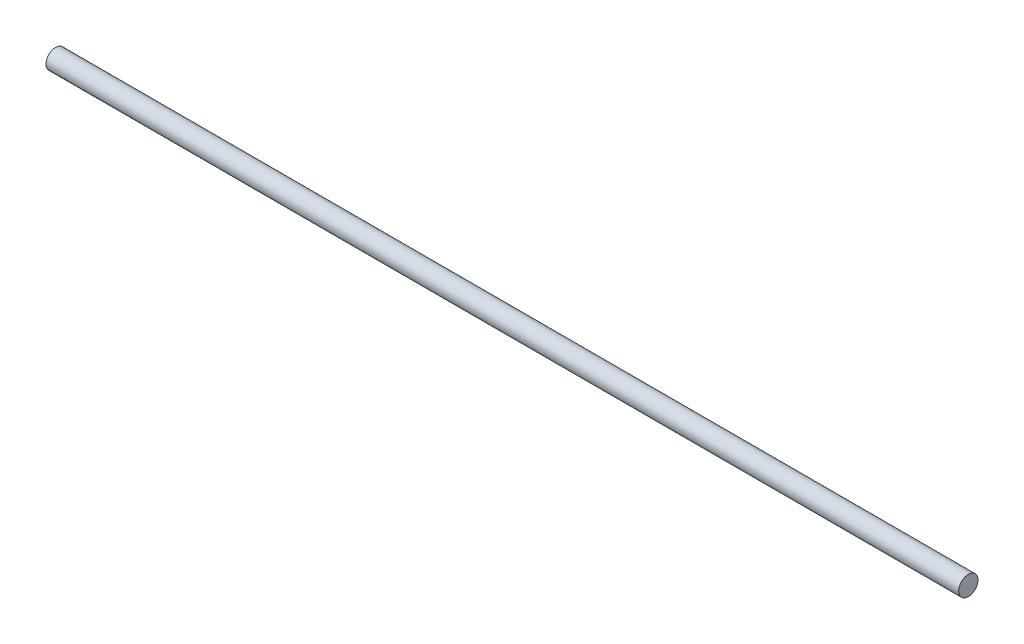
ISO-10303-21;
HEADER;
FILE_DESCRIPTION(('STEP AP214'),'2;1');
FILE_NAME('part.step','',(''),(''),'','','');
FILE_SCHEMA(('AUTOMOTIVE_DESIGN { 1 0 10303 214 1 1 1 1 }'));
ENDSEC;
DATA;
#1=APPLICATION_CONTEXT('core data for automotive mechanical design processes');
#2=APPLICATION_PROTOCOL_DEFINITION('international standard','automotive_design',2000,#1);
#3=PRODUCT_CONTEXT('',#1,'mechanical');
#4=PRODUCT('Part','Part','',(#3));
#5=PRODUCT_RELATED_PRODUCT_CATEGORY('part','',(#4));
#6=PRODUCT_DEFINITION_FORMATION('','',#4);
#7=PRODUCT_DEFINITION_CONTEXT('part definition',#1,'design');
#8=PRODUCT_DEFINITION('design','',#6,#7);
#9=PRODUCT_DEFINITION_SHAPE('','',#8);
#10=(LENGTH_UNIT() NAMED_UNIT(*) SI_UNIT(.MILLI.,.METRE.));
#11=(NAMED_UNIT(*) PLANE_ANGLE_UNIT() SI_UNIT($,.RADIAN.));
#12=(NAMED_UNIT(*) SI_UNIT($,.STERADIAN.) SOLID_ANGLE_UNIT());
#13=UNCERTAINTY_MEASURE_WITH_UNIT(LENGTH_MEASURE(1.E-05),#10,'distance_accuracy_value','');
#14=(GEOMETRIC_REPRESENTATION_CONTEXT(3) GLOBAL_UNCERTAINTY_ASSIGNED_CONTEXT((#13)) GLOBAL_UNIT_ASSIGNED_CONTEXT((#10,
#11,#12)) REPRESENTATION_CONTEXT('',''));
#15=CARTESIAN_POINT('',(0.,0.,0.));
#16=DIRECTION('',(0.,0.,1.));
#17=DIRECTION('',(1.,0.,0.));
#18=AXIS2_PLACEMENT_3D('',#15,#16,#17);
#19=CARTESIAN_POINT('',(149.987,0.,0.));
#20=DIRECTION('',(-1.,0.,0.));
#21=DIRECTION('',(0.,0.,1.));
#22=AXIS2_PLACEMENT_3D('',#19,#20,#21);
#23=CYLINDRICAL_SURFACE('',#22,3.175);
#24=CARTESIAN_POINT('',(149.987,0.,0.));
#25=DIRECTION('',(1.,0.,0.));
#26=DIRECTION('',(0.,0.,-1.));
#27=AXIS2_PLACEMENT_3D('',#24,#25,#26);
#28=CIRCLE('',#27,3.175);
#29=CARTESIAN_POINT('',(149.987,0.,-3.175));
#30=VERTEX_POINT('',#29);
#31=EDGE_CURVE('E10',#30,#30,#28,.T.);
#32=ORIENTED_EDGE('',*,*,#31,.F.);
#33=EDGE_LOOP('',(#32));
#34=FACE_BOUND('',#33,.T.);
#35=CARTESIAN_POINT('',(-149.987,0.,0.));
#36=DIRECTION('',(1.,0.,0.));
#37=DIRECTION('',(0.,0.,-1.));
#38=AXIS2_PLACEMENT_3D('',#35,#36,#37);
#39=CIRCLE('',#38,3.175);
#40=CARTESIAN_POINT('',(-149.987,0.,-3.175));
#41=VERTEX_POINT('',#40);
#42=EDGE_CURVE('E48',#41,#41,#39,.T.);
#43=ORIENTED_EDGE('',*,*,#42,.T.);
#44=EDGE_LOOP('',(#43));
#45=FACE_BOUND('',#44,.T.);
#46=ADVANCED_FACE('F45',(#34,#45),#23,.T.);
#47=CARTESIAN_POINT('',(149.987,0.,0.));
#48=DIRECTION('',(1.,0.,0.));
#49=DIRECTION('',(0.,0.,-1.));
#50=AXIS2_PLACEMENT_3D('',#47,#48,#49);
#51=PLANE('',#50);
#52=ORIENTED_EDGE('',*,*,#31,.T.);
#53=EDGE_LOOP('',(#52));
#54=FACE_BOUND('',#53,.T.);
#55=ADVANCED_FACE('F62',(#54),#51,.T.);
#56=CARTESIAN_POINT('',(-149.987,0.,0.));
#57=DIRECTION('',(1.,0.,0.));
#58=DIRECTION('',(0.,0.,-1.));
#59=AXIS2_PLACEMENT_3D('',#56,#57,#58);
#60=PLANE('',#59);
#61=ORIENTED_EDGE('',*,*,#42,.F.);
#62=EDGE_LOOP('',(#61));
#63=FACE_BOUND('',#62,.T.);
#64=ADVANCED_FACE('F60',(#63),#60,.F.);
#65=CLOSED_SHELL('',(#46,#55,#64));
#66=MANIFOLD_SOLID_BREP('B2',#65);
#67=ADVANCED_BREP_SHAPE_REPRESENTATION('',(#18,#66),#14);
#68=SHAPE_DEFINITION_REPRESENTATION(#9,#67);
ENDSEC;
END-ISO-10303-21;
